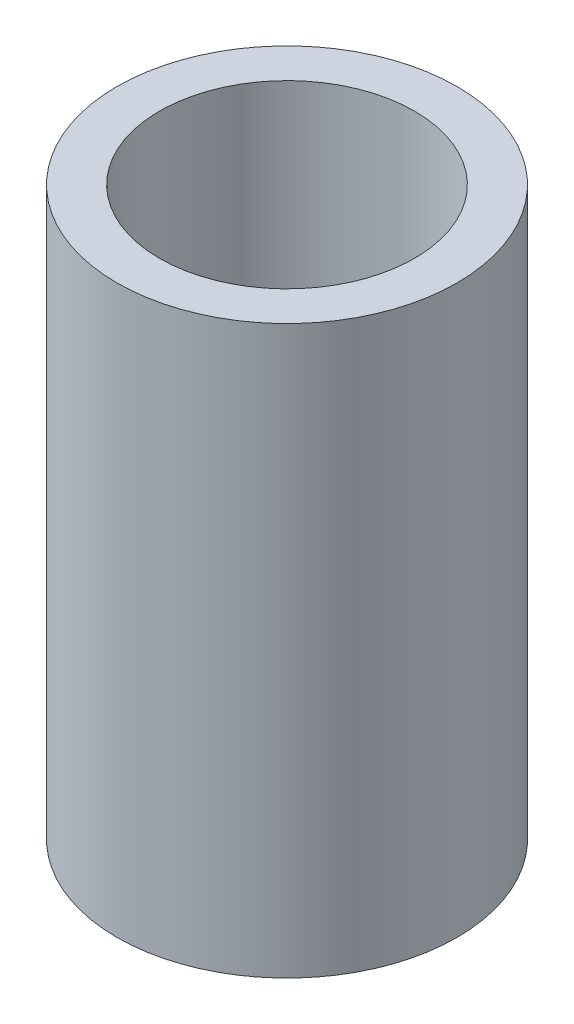
ISO-10303-21;
HEADER;
FILE_DESCRIPTION(('STEP AP214'),'2;1');
FILE_NAME('part.step','',(''),(''),'','','');
FILE_SCHEMA(('AUTOMOTIVE_DESIGN { 1 0 10303 214 1 1 1 1 }'));
ENDSEC;
DATA;
#1=APPLICATION_CONTEXT('core data for automotive mechanical design processes');
#2=APPLICATION_PROTOCOL_DEFINITION('international standard','automotive_design',2000,#1);
#3=PRODUCT_CONTEXT('',#1,'mechanical');
#4=PRODUCT('Part','Part','',(#3));
#5=PRODUCT_RELATED_PRODUCT_CATEGORY('part','',(#4));
#6=PRODUCT_DEFINITION_FORMATION('','',#4);
#7=PRODUCT_DEFINITION_CONTEXT('part definition',#1,'design');
#8=PRODUCT_DEFINITION('design','',#6,#7);
#9=PRODUCT_DEFINITION_SHAPE('','',#8);
#10=(LENGTH_UNIT() NAMED_UNIT(*) SI_UNIT(.MILLI.,.METRE.));
#11=(NAMED_UNIT(*) PLANE_ANGLE_UNIT() SI_UNIT($,.RADIAN.));
#12=(NAMED_UNIT(*) SI_UNIT($,.STERADIAN.) SOLID_ANGLE_UNIT());
#13=UNCERTAINTY_MEASURE_WITH_UNIT(LENGTH_MEASURE(1.E-05),#10,'distance_accuracy_value','');
#14=(GEOMETRIC_REPRESENTATION_CONTEXT(3) GLOBAL_UNCERTAINTY_ASSIGNED_CONTEXT((#13)) GLOBAL_UNIT_ASSIGNED_CONTEXT((#10,
#11,#12)) REPRESENTATION_CONTEXT('',''));
#15=CARTESIAN_POINT('',(0.,0.,0.));
#16=DIRECTION('',(0.,0.,1.));
#17=DIRECTION('',(1.,0.,0.));
#18=AXIS2_PLACEMENT_3D('',#15,#16,#17);
#19=CARTESIAN_POINT('',(-12.,20.,0.));
#20=DIRECTION('',(0.,-1.,0.));
#21=DIRECTION('',(0.,0.,-1.));
#22=AXIS2_PLACEMENT_3D('',#19,#20,#21);
#23=PLANE('',#22);
#24=CARTESIAN_POINT('',(0.,20.,0.));
#25=DIRECTION('',(0.,-1.,0.));
#26=DIRECTION('',(0.,0.,-1.));
#27=AXIS2_PLACEMENT_3D('',#24,#25,#26);
#28=CIRCLE('',#27,12.);
#29=CARTESIAN_POINT('',(0.,20.,-12.));
#30=VERTEX_POINT('',#29);
#31=EDGE_CURVE('E45',#30,#30,#28,.T.);
#32=ORIENTED_EDGE('',*,*,#31,.F.);
#33=EDGE_LOOP('',(#32));
#34=FACE_BOUND('',#33,.T.);
#35=CARTESIAN_POINT('',(0.,20.,0.));
#36=DIRECTION('',(0.,-1.,0.));
#37=DIRECTION('',(0.,0.,-1.));
#38=AXIS2_PLACEMENT_3D('',#35,#36,#37);
#39=CIRCLE('',#38,9.);
#40=CARTESIAN_POINT('',(0.,20.,-9.));
#41=VERTEX_POINT('',#40);
#42=EDGE_CURVE('E10',#41,#41,#39,.T.);
#43=ORIENTED_EDGE('',*,*,#42,.T.);
#44=EDGE_LOOP('',(#43));
#45=FACE_BOUND('',#44,.T.);
#46=ADVANCED_FACE('F31',(#34,#45),#23,.F.);
#47=CARTESIAN_POINT('',(0.,-20.,0.));
#48=DIRECTION('',(0.,-1.,0.));
#49=DIRECTION('',(0.,0.,-1.));
#50=AXIS2_PLACEMENT_3D('',#47,#48,#49);
#51=CYLINDRICAL_SURFACE('',#50,9.);
#52=ORIENTED_EDGE('',*,*,#42,.F.);
#53=EDGE_LOOP('',(#52));
#54=FACE_BOUND('',#53,.T.);
#55=CARTESIAN_POINT('',(0.,-20.,0.));
#56=DIRECTION('',(0.,-1.,0.));
#57=DIRECTION('',(0.,0.,-1.));
#58=AXIS2_PLACEMENT_3D('',#55,#56,#57);
#59=CIRCLE('',#58,9.);
#60=CARTESIAN_POINT('',(0.,-20.,-9.));
#61=VERTEX_POINT('',#60);
#62=EDGE_CURVE('E37',#61,#61,#59,.T.);
#63=ORIENTED_EDGE('',*,*,#62,.T.);
#64=EDGE_LOOP('',(#63));
#65=FACE_BOUND('',#64,.T.);
#66=ADVANCED_FACE('F54',(#54,#65),#51,.F.);
#67=CARTESIAN_POINT('',(-9.,-20.,0.));
#68=DIRECTION('',(0.,1.,0.));
#69=DIRECTION('',(0.,0.,1.));
#70=AXIS2_PLACEMENT_3D('',#67,#68,#69);
#71=PLANE('',#70);
#72=ORIENTED_EDGE('',*,*,#62,.F.);
#73=EDGE_LOOP('',(#72));
#74=FACE_BOUND('',#73,.T.);
#75=CARTESIAN_POINT('',(0.,-20.,0.));
#76=DIRECTION('',(0.,-1.,0.));
#77=DIRECTION('',(0.,0.,-1.));
#78=AXIS2_PLACEMENT_3D('',#75,#76,#77);
#79=CIRCLE('',#78,12.);
#80=CARTESIAN_POINT('',(0.,-20.,-12.));
#81=VERTEX_POINT('',#80);
#82=EDGE_CURVE('E41',#81,#81,#79,.T.);
#83=ORIENTED_EDGE('',*,*,#82,.T.);
#84=EDGE_LOOP('',(#83));
#85=FACE_BOUND('',#84,.T.);
#86=ADVANCED_FACE('F58',(#74,#85),#71,.F.);
#87=CARTESIAN_POINT('',(0.,-20.,0.));
#88=DIRECTION('',(0.,-1.,0.));
#89=DIRECTION('',(0.,0.,-1.));
#90=AXIS2_PLACEMENT_3D('',#87,#88,#89);
#91=CYLINDRICAL_SURFACE('',#90,12.);
#92=ORIENTED_EDGE('',*,*,#82,.F.);
#93=EDGE_LOOP('',(#92));
#94=FACE_BOUND('',#93,.T.);
#95=ORIENTED_EDGE('',*,*,#31,.T.);
#96=EDGE_LOOP('',(#95));
#97=FACE_BOUND('',#96,.T.);
#98=ADVANCED_FACE('F51',(#94,#97),#91,.T.);
#99=CLOSED_SHELL('',(#46,#66,#86,#98));
#100=MANIFOLD_SOLID_BREP('B2',#99);
#101=ADVANCED_BREP_SHAPE_REPRESENTATION('',(#18,#100),#14);
#102=SHAPE_DEFINITION_REPRESENTATION(#9,#101);
ENDSEC;
END-ISO-10303-21;
